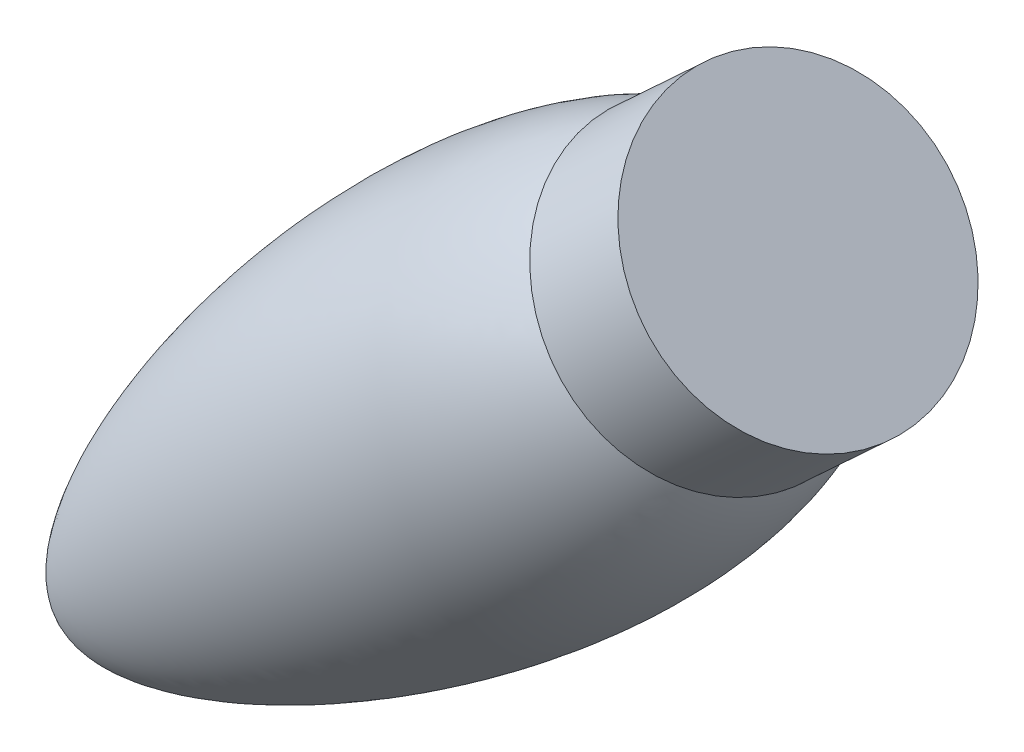
ISO-10303-21;
HEADER;
FILE_DESCRIPTION(('STEP AP214'),'2;1');
FILE_NAME('part.step','',(''),(''),'','','');
FILE_SCHEMA(('AUTOMOTIVE_DESIGN { 1 0 10303 214 1 1 1 1 }'));
ENDSEC;
DATA;
#1=APPLICATION_CONTEXT('core data for automotive mechanical design processes');
#2=APPLICATION_PROTOCOL_DEFINITION('international standard','automotive_design',2000,#1);
#3=PRODUCT_CONTEXT('',#1,'mechanical');
#4=PRODUCT('Part','Part','',(#3));
#5=PRODUCT_RELATED_PRODUCT_CATEGORY('part','',(#4));
#6=PRODUCT_DEFINITION_FORMATION('','',#4);
#7=PRODUCT_DEFINITION_CONTEXT('part definition',#1,'design');
#8=PRODUCT_DEFINITION('design','',#6,#7);
#9=PRODUCT_DEFINITION_SHAPE('','',#8);
#10=(LENGTH_UNIT() NAMED_UNIT(*) SI_UNIT(.MILLI.,.METRE.));
#11=(NAMED_UNIT(*) PLANE_ANGLE_UNIT() SI_UNIT($,.RADIAN.));
#12=(NAMED_UNIT(*) SI_UNIT($,.STERADIAN.) SOLID_ANGLE_UNIT());
#13=UNCERTAINTY_MEASURE_WITH_UNIT(LENGTH_MEASURE(1.E-05),#10,'distance_accuracy_value','');
#14=(GEOMETRIC_REPRESENTATION_CONTEXT(3) GLOBAL_UNCERTAINTY_ASSIGNED_CONTEXT((#13)) GLOBAL_UNIT_ASSIGNED_CONTEXT((#10,
#11,#12)) REPRESENTATION_CONTEXT('',''));
#15=CARTESIAN_POINT('',(0.,0.,0.));
#16=DIRECTION('',(0.,0.,1.));
#17=DIRECTION('',(1.,0.,0.));
#18=AXIS2_PLACEMENT_3D('',#15,#16,#17);
#19=CARTESIAN_POINT('',(-15.6058308480985,13.54121103047,0.));
#20=DIRECTION('',(-0.733813316706241,-0.679351172976529,0.));
#21=DIRECTION('',(0.679351172976529,-0.733813316706241,0.));
#22=AXIS2_PLACEMENT_3D('',#19,#20,#21);
#23=CYLINDRICAL_SURFACE('',#22,6.20405324199829);
#24=CARTESIAN_POINT('',(-15.6058308480985,13.54121103047,0.));
#25=DIRECTION('',(-0.733813316706241,-0.679351172976529,0.));
#26=DIRECTION('',(0.679351172976529,-0.733813316706241,0.));
#27=AXIS2_PLACEMENT_3D('',#24,#25,#26);
#28=CIRCLE('',#27,6.20405324199829);
#29=CARTESIAN_POINT('',(-11.3911000009381,8.98859414393713,0.));
#30=VERTEX_POINT('',#29);
#31=EDGE_CURVE('E11',#30,#30,#28,.T.);
#32=ORIENTED_EDGE('',*,*,#31,.T.);
#33=EDGE_LOOP('',(#32));
#34=FACE_BOUND('',#33,.T.);
#35=CARTESIAN_POINT('',(-19.2748974316297,10.1444551655874,0.));
#36=DIRECTION('',(-0.733813316706241,-0.679351172976529,0.));
#37=DIRECTION('',(0.679351172976529,-0.733813316706241,0.));
#38=AXIS2_PLACEMENT_3D('',#35,#36,#37);
#39=CIRCLE('',#38,6.20405324199829);
#40=CARTESIAN_POINT('',(-15.0601665844693,5.59183827905449,0.));
#41=VERTEX_POINT('',#40);
#42=EDGE_CURVE('E44',#41,#41,#39,.T.);
#43=ORIENTED_EDGE('',*,*,#42,.F.);
#44=EDGE_LOOP('',(#43));
#45=FACE_BOUND('',#44,.T.);
#46=ADVANCED_FACE('F41',(#34,#45),#23,.T.);
#47=CARTESIAN_POINT('',(-15.6058308480985,13.54121103047,0.));
#48=DIRECTION('',(-0.733813316706241,-0.679351172976529,0.));
#49=DIRECTION('',(0.679351172976529,-0.733813316706241,0.));
#50=AXIS2_PLACEMENT_3D('',#47,#48,#49);
#51=PLANE('',#50);
#52=ORIENTED_EDGE('',*,*,#31,.F.);
#53=EDGE_LOOP('',(#52));
#54=FACE_BOUND('',#53,.T.);
#55=ADVANCED_FACE('F56',(#54),#51,.F.);
#56=CARTESIAN_POINT('',(-19.2748974316297,10.1444551655874,0.));
#57=DIRECTION('',(-0.733813316706241,-0.679351172976529,0.));
#58=DIRECTION('',(0.679351172976529,-0.733813316706241,0.));
#59=AXIS2_PLACEMENT_3D('',#56,#57,#58);
#60=PLANE('',#59);
#61=ORIENTED_EDGE('',*,*,#42,.T.);
#62=EDGE_LOOP('',(#61));
#63=FACE_BOUND('',#62,.T.);
#64=ADVANCED_FACE('F53',(#63),#60,.T.);
#65=CLOSED_SHELL('',(#46,#55,#64));
#66=MANIFOLD_SOLID_BREP('B2',#65);
#67=CARTESIAN_POINT('',(-23.3370102444859,14.5322189534625,0.));
#68=CARTESIAN_POINT('',(-35.1044603127619,9.8177563823048,0.));
#69=CARTESIAN_POINT('',(-48.623794714042,-11.0631630361881,0.));
#70=CARTESIAN_POINT('',(-45.3417997771714,-14.1408863490054,0.));
#71=B_SPLINE_CURVE_WITH_KNOTS('',3,(#67,#68,#69,#70),.UNSPECIFIED.,.F.,.F.,(4,4),(0.,
0.69219033859195),.UNSPECIFIED.);
#72=CARTESIAN_POINT('',(-26.56652355,3.24092676,0.));
#73=DIRECTION('',(0.733813316706241,0.679351172976529,0.));
#74=AXIS1_PLACEMENT('',#72,#73);
#75=SURFACE_OF_REVOLUTION('',#71,#74);
#76=CARTESIAN_POINT('',(-45.3417997771714,-14.1408863490054,0.));
#77=VERTEX_POINT('',#76);
#78=VERTEX_LOOP('',#77);
#79=FACE_BOUND('',#78,.T.);
#80=CARTESIAN_POINT('',(-19.1985884144776,10.0620286162585,0.));
#81=DIRECTION('',(0.733813316706241,0.679351172976529,0.));
#82=DIRECTION('',(-0.679351172976529,0.733813316706241,0.));
#83=AXIS2_PLACEMENT_3D('',#80,#81,#82);
#84=CIRCLE('',#83,6.09172692213964);
#85=CARTESIAN_POINT('',(-23.3370102444859,14.5322189534625,0.));
#86=VERTEX_POINT('',#85);
#87=EDGE_CURVE('E39',#86,#86,#84,.T.);
#88=ORIENTED_EDGE('',*,*,#87,.F.);
#89=EDGE_LOOP('',(#88));
#90=FACE_BOUND('',#89,.T.);
#91=ADVANCED_FACE('F82',(#79,#90),#75,.F.);
#92=CARTESIAN_POINT('',(-26.56652355,3.24092676,0.));
#93=DIRECTION('',(0.733813316706241,0.679351172976529,0.));
#94=DIRECTION('',(-0.679351172976529,0.733813316706241,0.));
#95=AXIS2_PLACEMENT_3D('',#92,#93,#94);
#96=CONICAL_SURFACE('',#95,0.,0.545337770387867);
#97=ORIENTED_EDGE('',*,*,#87,.T.);
#98=EDGE_LOOP('',(#97));
#99=FACE_BOUND('',#98,.T.);
#100=CARTESIAN_POINT('',(-26.56652355,3.24092676,0.));
#101=VERTEX_POINT('',#100);
#102=VERTEX_LOOP('',#101);
#103=FACE_BOUND('',#102,.T.);
#104=ADVANCED_FACE('F96',(#99,#103),#96,.F.);
#105=CLOSED_SHELL('',(#91,#104));
#106=MANIFOLD_SOLID_BREP('B6',#105);
#107=ADVANCED_BREP_SHAPE_REPRESENTATION('',(#18,#66,#106),#14);
#108=SHAPE_DEFINITION_REPRESENTATION(#9,#107);
ENDSEC;
END-ISO-10303-21;
